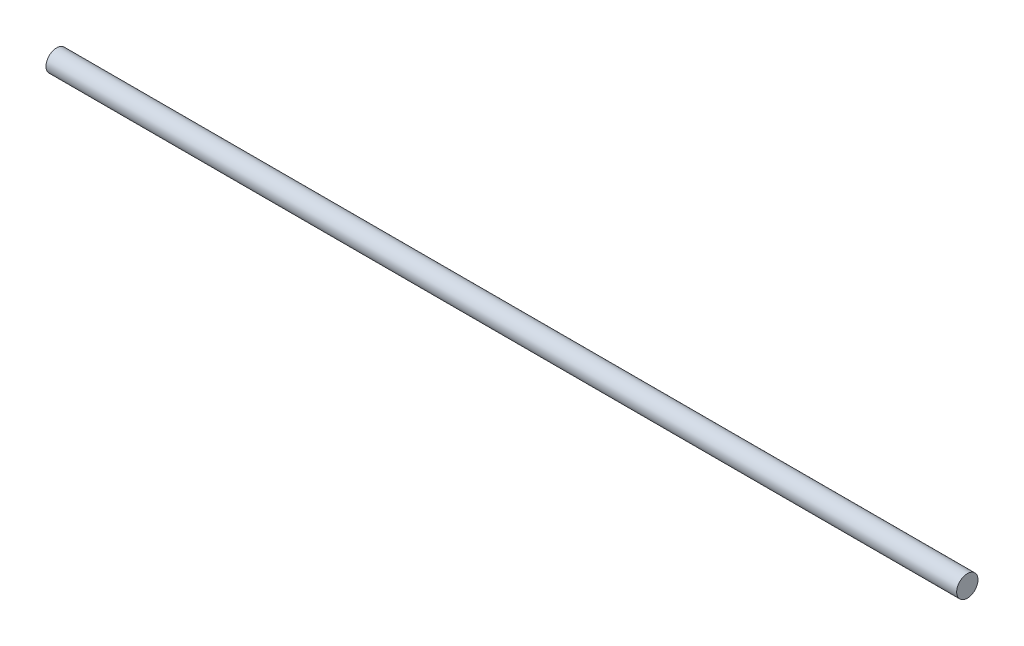
ISO-10303-21;
HEADER;
FILE_DESCRIPTION(('STEP AP214'),'2;1');
FILE_NAME('part.step','',(''),(''),'','','');
FILE_SCHEMA(('AUTOMOTIVE_DESIGN { 1 0 10303 214 1 1 1 1 }'));
ENDSEC;
DATA;
#1=APPLICATION_CONTEXT('core data for automotive mechanical design processes');
#2=APPLICATION_PROTOCOL_DEFINITION('international standard','automotive_design',2000,#1);
#3=PRODUCT_CONTEXT('',#1,'mechanical');
#4=PRODUCT('Part','Part','',(#3));
#5=PRODUCT_RELATED_PRODUCT_CATEGORY('part','',(#4));
#6=PRODUCT_DEFINITION_FORMATION('','',#4);
#7=PRODUCT_DEFINITION_CONTEXT('part definition',#1,'design');
#8=PRODUCT_DEFINITION('design','',#6,#7);
#9=PRODUCT_DEFINITION_SHAPE('','',#8);
#10=(LENGTH_UNIT() NAMED_UNIT(*) SI_UNIT(.MILLI.,.METRE.));
#11=(NAMED_UNIT(*) PLANE_ANGLE_UNIT() SI_UNIT($,.RADIAN.));
#12=(NAMED_UNIT(*) SI_UNIT($,.STERADIAN.) SOLID_ANGLE_UNIT());
#13=UNCERTAINTY_MEASURE_WITH_UNIT(LENGTH_MEASURE(1.E-05),#10,'distance_accuracy_value','');
#14=(GEOMETRIC_REPRESENTATION_CONTEXT(3) GLOBAL_UNCERTAINTY_ASSIGNED_CONTEXT((#13)) GLOBAL_UNIT_ASSIGNED_CONTEXT((#10,
#11,#12)) REPRESENTATION_CONTEXT('',''));
#15=CARTESIAN_POINT('',(0.,0.,0.));
#16=DIRECTION('',(0.,0.,1.));
#17=DIRECTION('',(1.,0.,0.));
#18=AXIS2_PLACEMENT_3D('',#15,#16,#17);
#19=CARTESIAN_POINT('',(406.4,0.,0.));
#20=DIRECTION('',(-1.,0.,0.));
#21=DIRECTION('',(0.,0.,1.));
#22=AXIS2_PLACEMENT_3D('',#19,#20,#21);
#23=CYLINDRICAL_SURFACE('',#22,4.7625);
#24=CARTESIAN_POINT('',(406.4,0.,0.));
#25=DIRECTION('',(1.,0.,0.));
#26=DIRECTION('',(0.,0.,-1.));
#27=AXIS2_PLACEMENT_3D('',#24,#25,#26);
#28=CIRCLE('',#27,4.7625);
#29=CARTESIAN_POINT('',(406.4,0.,-4.7625));
#30=VERTEX_POINT('',#29);
#31=EDGE_CURVE('E10',#30,#30,#28,.T.);
#32=ORIENTED_EDGE('',*,*,#31,.F.);
#33=EDGE_LOOP('',(#32));
#34=FACE_BOUND('',#33,.T.);
#35=CARTESIAN_POINT('',(0.,0.,0.));
#36=DIRECTION('',(1.,0.,0.));
#37=DIRECTION('',(0.,0.,-1.));
#38=AXIS2_PLACEMENT_3D('',#35,#36,#37);
#39=CIRCLE('',#38,4.7625);
#40=CARTESIAN_POINT('',(0.,0.,-4.7625));
#41=VERTEX_POINT('',#40);
#42=EDGE_CURVE('E34',#41,#41,#39,.T.);
#43=ORIENTED_EDGE('',*,*,#42,.T.);
#44=EDGE_LOOP('',(#43));
#45=FACE_BOUND('',#44,.T.);
#46=ADVANCED_FACE('F31',(#34,#45),#23,.T.);
#47=CARTESIAN_POINT('',(406.4,0.,0.));
#48=DIRECTION('',(1.,0.,0.));
#49=DIRECTION('',(0.,0.,-1.));
#50=AXIS2_PLACEMENT_3D('',#47,#48,#49);
#51=PLANE('',#50);
#52=ORIENTED_EDGE('',*,*,#31,.T.);
#53=EDGE_LOOP('',(#52));
#54=FACE_BOUND('',#53,.T.);
#55=ADVANCED_FACE('F46',(#54),#51,.T.);
#56=CARTESIAN_POINT('',(0.,0.,0.));
#57=DIRECTION('',(1.,0.,0.));
#58=DIRECTION('',(0.,0.,-1.));
#59=AXIS2_PLACEMENT_3D('',#56,#57,#58);
#60=PLANE('',#59);
#61=ORIENTED_EDGE('',*,*,#42,.F.);
#62=EDGE_LOOP('',(#61));
#63=FACE_BOUND('',#62,.T.);
#64=ADVANCED_FACE('F44',(#63),#60,.F.);
#65=CLOSED_SHELL('',(#46,#55,#64));
#66=MANIFOLD_SOLID_BREP('B2',#65);
#67=ADVANCED_BREP_SHAPE_REPRESENTATION('',(#18,#66),#14);
#68=SHAPE_DEFINITION_REPRESENTATION(#9,#67);
ENDSEC;
END-ISO-10303-21;
